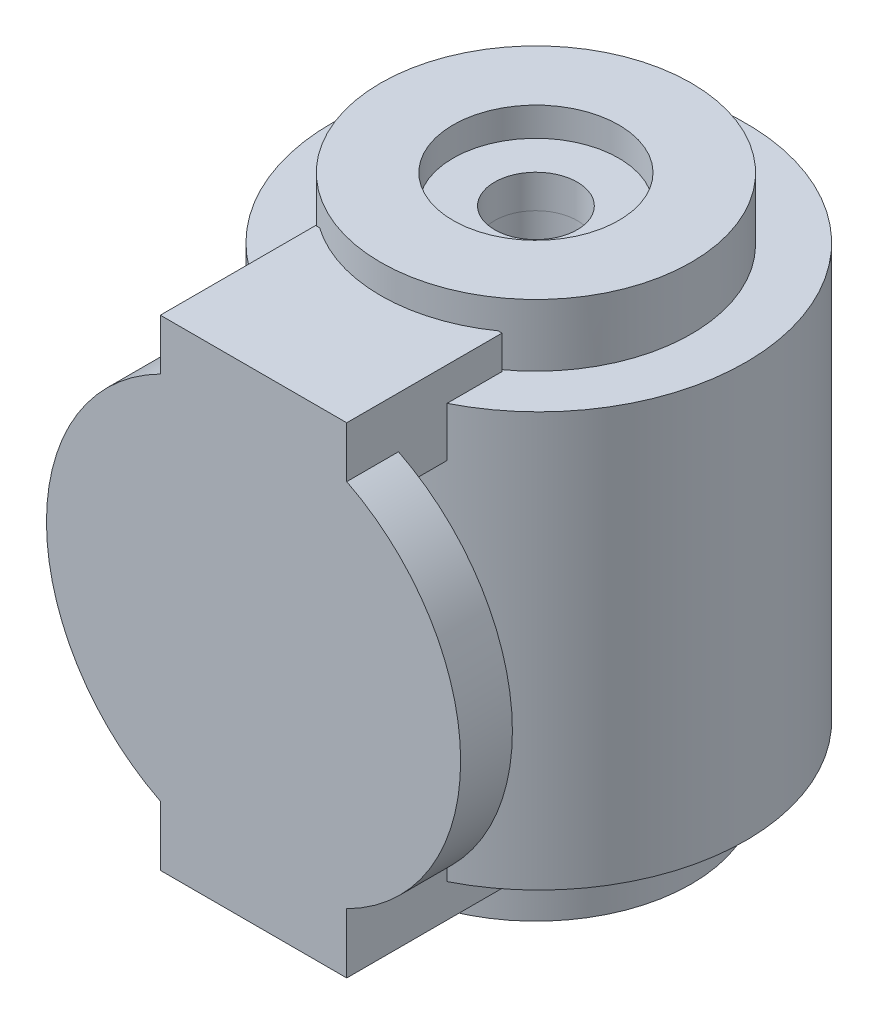
ISO-10303-21;
HEADER;
FILE_DESCRIPTION(('STEP AP214'),'2;1');
FILE_NAME('part.step','',(''),(''),'','','');
FILE_SCHEMA(('AUTOMOTIVE_DESIGN { 1 0 10303 214 1 1 1 1 }'));
ENDSEC;
DATA;
#1=APPLICATION_CONTEXT('core data for automotive mechanical design processes');
#2=APPLICATION_PROTOCOL_DEFINITION('international standard','automotive_design',2000,#1);
#3=PRODUCT_CONTEXT('',#1,'mechanical');
#4=PRODUCT('Part','Part','',(#3));
#5=PRODUCT_RELATED_PRODUCT_CATEGORY('part','',(#4));
#6=PRODUCT_DEFINITION_FORMATION('','',#4);
#7=PRODUCT_DEFINITION_CONTEXT('part definition',#1,'design');
#8=PRODUCT_DEFINITION('design','',#6,#7);
#9=PRODUCT_DEFINITION_SHAPE('','',#8);
#10=(LENGTH_UNIT() NAMED_UNIT(*) SI_UNIT(.MILLI.,.METRE.));
#11=(NAMED_UNIT(*) PLANE_ANGLE_UNIT() SI_UNIT($,.RADIAN.));
#12=(NAMED_UNIT(*) SI_UNIT($,.STERADIAN.) SOLID_ANGLE_UNIT());
#13=UNCERTAINTY_MEASURE_WITH_UNIT(LENGTH_MEASURE(1.E-05),#10,'distance_accuracy_value','');
#14=(GEOMETRIC_REPRESENTATION_CONTEXT(3) GLOBAL_UNCERTAINTY_ASSIGNED_CONTEXT((#13)) GLOBAL_UNIT_ASSIGNED_CONTEXT((#10,
#11,#12)) REPRESENTATION_CONTEXT('',''));
#15=CARTESIAN_POINT('',(0.,0.,0.));
#16=DIRECTION('',(0.,0.,1.));
#17=DIRECTION('',(1.,0.,0.));
#18=AXIS2_PLACEMENT_3D('',#15,#16,#17);
#19=CARTESIAN_POINT('',(0.,-27.2140253350102,-22.2721230621628));
#20=DIRECTION('',(0.,1.,0.));
#21=DIRECTION('',(0.,0.,1.));
#22=AXIS2_PLACEMENT_3D('',#19,#20,#21);
#23=CYLINDRICAL_SURFACE('',#22,4.);
#24=CARTESIAN_POINT('',(0.,-23.6524818491745,-22.2721230621628));
#25=DIRECTION('',(0.,-1.,0.));
#26=DIRECTION('',(0.,0.,-1.));
#27=AXIS2_PLACEMENT_3D('',#24,#25,#26);
#28=CIRCLE('',#27,4.);
#29=CARTESIAN_POINT('',(0.,-23.6524818491745,-26.2721230621628));
#30=VERTEX_POINT('',#29);
#31=EDGE_CURVE('E212',#30,#30,#28,.T.);
#32=ORIENTED_EDGE('',*,*,#31,.T.);
#33=EDGE_LOOP('',(#32));
#34=FACE_BOUND('',#33,.T.);
#35=CARTESIAN_POINT('',(0.,19.5659746649898,-22.2721230621628));
#36=DIRECTION('',(0.,1.,0.));
#37=DIRECTION('',(0.,0.,1.));
#38=AXIS2_PLACEMENT_3D('',#35,#36,#37);
#39=CIRCLE('',#38,4.);
#40=CARTESIAN_POINT('',(0.,19.5659746649898,-18.2721230621628));
#41=VERTEX_POINT('',#40);
#42=EDGE_CURVE('E11',#41,#41,#39,.F.);
#43=ORIENTED_EDGE('',*,*,#42,.F.);
#44=EDGE_LOOP('',(#43));
#45=FACE_BOUND('',#44,.T.);
#46=ADVANCED_FACE('F38',(#34,#45),#23,.F.);
#47=CARTESIAN_POINT('',(0.,0.,-10.));
#48=DIRECTION('',(0.,0.,1.));
#49=DIRECTION('',(1.,0.,0.));
#50=AXIS2_PLACEMENT_3D('',#47,#48,#49);
#51=PLANE('',#50);
#52=DIRECTION('',(0.,1.,0.));
#53=VECTOR('',#52,1.);
#54=CARTESIAN_POINT('',(8.6252533613299,-26.4340253350102,-10.));
#55=LINE('',#54,#53);
#56=CARTESIAN_POINT('',(8.6252533613299,-20.4340253350102,-10.));
#57=VERTEX_POINT('',#56);
#58=CARTESIAN_POINT('',(8.6252533613299,-23.6524818491745,-10.));
#59=VERTEX_POINT('',#58);
#60=EDGE_CURVE('E174',#57,#59,#55,.F.);
#61=ORIENTED_EDGE('',*,*,#60,.F.);
#62=DIRECTION('',(1.,0.,0.));
#63=VECTOR('',#62,1.);
#64=CARTESIAN_POINT('',(0.,-20.4340253350102,-10.));
#65=LINE('',#64,#63);
#66=CARTESIAN_POINT('',(9.,-20.4340253350102,-10.));
#67=VERTEX_POINT('',#66);
#68=EDGE_CURVE('E185',#57,#67,#65,.T.);
#69=ORIENTED_EDGE('',*,*,#68,.T.);
#70=DIRECTION('',(0.,1.,0.));
#71=VECTOR('',#70,1.);
#72=CARTESIAN_POINT('',(9.,-15.6524818491745,-10.));
#73=LINE('',#72,#71);
#74=CARTESIAN_POINT('',(9.,-23.6524818491745,-10.));
#75=VERTEX_POINT('',#74);
#76=EDGE_CURVE('E303',#75,#67,#73,.T.);
#77=ORIENTED_EDGE('',*,*,#76,.F.);
#78=DIRECTION('',(1.,0.,0.));
#79=VECTOR('',#78,1.);
#80=CARTESIAN_POINT('',(-9.,-23.6524818491745,-10.));
#81=LINE('',#80,#79);
#82=EDGE_CURVE('E187',#59,#75,#81,.T.);
#83=ORIENTED_EDGE('',*,*,#82,.F.);
#84=EDGE_LOOP('',(#61,#69,#77,#83));
#85=FACE_BOUND('',#84,.T.);
#86=ADVANCED_FACE('F183',(#85),#51,.F.);
#87=DIRECTION('',(0.,1.,0.));
#88=VECTOR('',#87,1.);
#89=CARTESIAN_POINT('',(-8.62525336133006,-26.4340253350102,-10.));
#90=LINE('',#89,#88);
#91=CARTESIAN_POINT('',(-8.62525336133006,-23.6524818491745,-10.));
#92=VERTEX_POINT('',#91);
#93=CARTESIAN_POINT('',(-8.62525336133006,-20.4340253350102,-10.));
#94=VERTEX_POINT('',#93);
#95=EDGE_CURVE('E53',#92,#94,#90,.T.);
#96=ORIENTED_EDGE('',*,*,#95,.F.);
#97=CARTESIAN_POINT('',(-9.,-23.6524818491745,-10.));
#98=VERTEX_POINT('',#97);
#99=EDGE_CURVE('E300',#98,#92,#81,.T.);
#100=ORIENTED_EDGE('',*,*,#99,.F.);
#101=DIRECTION('',(0.,-1.,0.));
#102=VECTOR('',#101,1.);
#103=CARTESIAN_POINT('',(-9.,-15.6524818491745,-10.));
#104=LINE('',#103,#102);
#105=CARTESIAN_POINT('',(-9.,-20.4340253350102,-10.));
#106=VERTEX_POINT('',#105);
#107=EDGE_CURVE('E297',#106,#98,#104,.T.);
#108=ORIENTED_EDGE('',*,*,#107,.F.);
#109=EDGE_CURVE('E196',#106,#94,#65,.T.);
#110=ORIENTED_EDGE('',*,*,#109,.T.);
#111=EDGE_LOOP('',(#96,#100,#108,#110));
#112=FACE_BOUND('',#111,.T.);
#113=ADVANCED_FACE('F429',(#112),#51,.F.);
#114=CARTESIAN_POINT('',(0.,0.,-10.));
#115=DIRECTION('',(0.,0.,-1.));
#116=DIRECTION('',(-1.,0.,0.));
#117=AXIS2_PLACEMENT_3D('',#114,#115,#116);
#118=PLANE('',#117);
#119=DIRECTION('',(0.,1.,0.));
#120=VECTOR('',#119,1.);
#121=CARTESIAN_POINT('',(-8.62525336132984,-16.8724818450102,-10.));
#122=LINE('',#121,#120);
#123=CARTESIAN_POINT('',(-8.62525336132984,19.5659746649898,-10.));
#124=VERTEX_POINT('',#123);
#125=CARTESIAN_POINT('',(-8.62525336132984,22.7859746649898,-10.));
#126=VERTEX_POINT('',#125);
#127=EDGE_CURVE('E236',#124,#126,#122,.T.);
#128=ORIENTED_EDGE('',*,*,#127,.F.);
#129=DIRECTION('',(-1.,0.,0.));
#130=VECTOR('',#129,1.);
#131=CARTESIAN_POINT('',(0.,19.5659746649898,-10.));
#132=LINE('',#131,#130);
#133=CARTESIAN_POINT('',(-9.,19.5659746649898,-10.));
#134=VERTEX_POINT('',#133);
#135=EDGE_CURVE('E351',#124,#134,#132,.T.);
#136=ORIENTED_EDGE('',*,*,#135,.T.);
#137=DIRECTION('',(0.,-1.,0.));
#138=VECTOR('',#137,1.);
#139=CARTESIAN_POINT('',(-9.,14.7859746649898,-10.));
#140=LINE('',#139,#138);
#141=CARTESIAN_POINT('',(-9.,22.7859746649898,-10.));
#142=VERTEX_POINT('',#141);
#143=EDGE_CURVE('E278',#142,#134,#140,.T.);
#144=ORIENTED_EDGE('',*,*,#143,.F.);
#145=DIRECTION('',(-1.,0.,0.));
#146=VECTOR('',#145,1.);
#147=CARTESIAN_POINT('',(-9.,22.7859746649898,-10.));
#148=LINE('',#147,#146);
#149=EDGE_CURVE('E267',#126,#142,#148,.T.);
#150=ORIENTED_EDGE('',*,*,#149,.F.);
#151=EDGE_LOOP('',(#128,#136,#144,#150));
#152=FACE_BOUND('',#151,.T.);
#153=ADVANCED_FACE('F360',(#152),#118,.T.);
#154=DIRECTION('',(0.,1.,0.));
#155=VECTOR('',#154,1.);
#156=CARTESIAN_POINT('',(8.62525336132984,-16.8724818450102,-10.));
#157=LINE('',#156,#155);
#158=CARTESIAN_POINT('',(8.62525336132984,22.7859746649898,-10.));
#159=VERTEX_POINT('',#158);
#160=CARTESIAN_POINT('',(8.62525336132984,19.5659746649898,-10.));
#161=VERTEX_POINT('',#160);
#162=EDGE_CURVE('E61',#159,#161,#157,.F.);
#163=ORIENTED_EDGE('',*,*,#162,.F.);
#164=CARTESIAN_POINT('',(9.,22.7859746649898,-10.));
#165=VERTEX_POINT('',#164);
#166=EDGE_CURVE('E284',#165,#159,#148,.T.);
#167=ORIENTED_EDGE('',*,*,#166,.F.);
#168=DIRECTION('',(0.,1.,0.));
#169=VECTOR('',#168,1.);
#170=CARTESIAN_POINT('',(9.,14.7859746649898,-10.));
#171=LINE('',#170,#169);
#172=CARTESIAN_POINT('',(9.,19.5659746649898,-10.));
#173=VERTEX_POINT('',#172);
#174=EDGE_CURVE('E287',#173,#165,#171,.T.);
#175=ORIENTED_EDGE('',*,*,#174,.F.);
#176=EDGE_CURVE('E199',#173,#161,#132,.T.);
#177=ORIENTED_EDGE('',*,*,#176,.T.);
#178=EDGE_LOOP('',(#163,#167,#175,#177));
#179=FACE_BOUND('',#178,.T.);
#180=ADVANCED_FACE('F378',(#179),#118,.T.);
#181=CARTESIAN_POINT('',(0.,0.,5.));
#182=DIRECTION('',(0.,0.,-1.));
#183=DIRECTION('',(-1.,0.,0.));
#184=AXIS2_PLACEMENT_3D('',#181,#182,#183);
#185=CYLINDRICAL_SURFACE('',#184,20.);
#186=CARTESIAN_POINT('',(0.,0.,5.));
#187=DIRECTION('',(0.,0.,1.));
#188=DIRECTION('',(1.,0.,0.));
#189=AXIS2_PLACEMENT_3D('',#186,#187,#188);
#190=CIRCLE('',#189,20.);
#191=CARTESIAN_POINT('',(-9.,17.8605710994918,5.));
#192=VERTEX_POINT('',#191);
#193=CARTESIAN_POINT('',(-9.,-17.8605710994918,5.));
#194=VERTEX_POINT('',#193);
#195=EDGE_CURVE('E331',#192,#194,#190,.T.);
#196=ORIENTED_EDGE('',*,*,#195,.F.);
#197=DIRECTION('',(0.,0.,-1.));
#198=VECTOR('',#197,1.);
#199=CARTESIAN_POINT('',(-9.,17.8605710994918,5.));
#200=LINE('',#199,#198);
#201=CARTESIAN_POINT('',(-9.,17.8605710994918,0.));
#202=VERTEX_POINT('',#201);
#203=EDGE_CURVE('E293',#192,#202,#200,.T.);
#204=ORIENTED_EDGE('',*,*,#203,.T.);
#205=CARTESIAN_POINT('',(0.,0.,0.));
#206=DIRECTION('',(0.,0.,1.));
#207=DIRECTION('',(1.,0.,0.));
#208=AXIS2_PLACEMENT_3D('',#205,#206,#207);
#209=CIRCLE('',#208,20.);
#210=CARTESIAN_POINT('',(-9.,-17.8605710994918,0.));
#211=VERTEX_POINT('',#210);
#212=EDGE_CURVE('E326',#202,#211,#209,.T.);
#213=ORIENTED_EDGE('',*,*,#212,.T.);
#214=DIRECTION('',(0.,0.,-1.));
#215=VECTOR('',#214,1.);
#216=CARTESIAN_POINT('',(-9.,-17.8605710994918,5.));
#217=LINE('',#216,#215);
#218=EDGE_CURVE('E323',#211,#194,#217,.F.);
#219=ORIENTED_EDGE('',*,*,#218,.T.);
#220=EDGE_LOOP('',(#196,#204,#213,#219));
#221=FACE_BOUND('',#220,.T.);
#222=ADVANCED_FACE('F397',(#221),#185,.T.);
#223=CARTESIAN_POINT('',(9.,-17.8605710994918,0.));
#224=VERTEX_POINT('',#223);
#225=CARTESIAN_POINT('',(9.,17.8605710994918,0.));
#226=VERTEX_POINT('',#225);
#227=EDGE_CURVE('E332',#224,#226,#209,.T.);
#228=ORIENTED_EDGE('',*,*,#227,.T.);
#229=DIRECTION('',(0.,0.,-1.));
#230=VECTOR('',#229,1.);
#231=CARTESIAN_POINT('',(9.,17.8605710994918,5.));
#232=LINE('',#231,#230);
#233=CARTESIAN_POINT('',(9.,17.8605710994918,5.));
#234=VERTEX_POINT('',#233);
#235=EDGE_CURVE('E283',#226,#234,#232,.F.);
#236=ORIENTED_EDGE('',*,*,#235,.T.);
#237=CARTESIAN_POINT('',(9.,-17.8605710994918,5.));
#238=VERTEX_POINT('',#237);
#239=EDGE_CURVE('E327',#238,#234,#190,.T.);
#240=ORIENTED_EDGE('',*,*,#239,.F.);
#241=DIRECTION('',(0.,0.,-1.));
#242=VECTOR('',#241,1.);
#243=CARTESIAN_POINT('',(9.,-17.8605710994918,5.));
#244=LINE('',#243,#242);
#245=EDGE_CURVE('E314',#238,#224,#244,.T.);
#246=ORIENTED_EDGE('',*,*,#245,.T.);
#247=EDGE_LOOP('',(#228,#236,#240,#246));
#248=FACE_BOUND('',#247,.T.);
#249=ADVANCED_FACE('F40',(#248),#185,.T.);
#250=CARTESIAN_POINT('',(0.,0.,5.));
#251=DIRECTION('',(0.,0.,1.));
#252=DIRECTION('',(1.,0.,0.));
#253=AXIS2_PLACEMENT_3D('',#250,#251,#252);
#254=PLANE('',#253);
#255=ORIENTED_EDGE('',*,*,#239,.T.);
#256=DIRECTION('',(0.,1.,0.));
#257=VECTOR('',#256,1.);
#258=CARTESIAN_POINT('',(9.,14.7859746649898,5.));
#259=LINE('',#258,#257);
#260=CARTESIAN_POINT('',(9.,22.7859746649898,5.));
#261=VERTEX_POINT('',#260);
#262=EDGE_CURVE('E277',#234,#261,#259,.T.);
#263=ORIENTED_EDGE('',*,*,#262,.T.);
#264=DIRECTION('',(-1.,0.,0.));
#265=VECTOR('',#264,1.);
#266=CARTESIAN_POINT('',(-9.,22.7859746649898,5.));
#267=LINE('',#266,#265);
#268=CARTESIAN_POINT('',(-9.,22.7859746649898,5.));
#269=VERTEX_POINT('',#268);
#270=EDGE_CURVE('E274',#261,#269,#267,.T.);
#271=ORIENTED_EDGE('',*,*,#270,.T.);
#272=DIRECTION('',(0.,-1.,0.));
#273=VECTOR('',#272,1.);
#274=CARTESIAN_POINT('',(-9.,14.7859746649898,5.));
#275=LINE('',#274,#273);
#276=EDGE_CURVE('E280',#269,#192,#275,.T.);
#277=ORIENTED_EDGE('',*,*,#276,.T.);
#278=ORIENTED_EDGE('',*,*,#195,.T.);
#279=DIRECTION('',(0.,-1.,0.));
#280=VECTOR('',#279,1.);
#281=CARTESIAN_POINT('',(-9.,-15.6524818491745,5.));
#282=LINE('',#281,#280);
#283=CARTESIAN_POINT('',(-9.,-23.6524818491745,5.));
#284=VERTEX_POINT('',#283);
#285=EDGE_CURVE('E296',#194,#284,#282,.T.);
#286=ORIENTED_EDGE('',*,*,#285,.T.);
#287=DIRECTION('',(1.,0.,0.));
#288=VECTOR('',#287,1.);
#289=CARTESIAN_POINT('',(-9.,-23.6524818491745,5.));
#290=LINE('',#289,#288);
#291=CARTESIAN_POINT('',(9.,-23.6524818491745,5.));
#292=VERTEX_POINT('',#291);
#293=EDGE_CURVE('E307',#284,#292,#290,.T.);
#294=ORIENTED_EDGE('',*,*,#293,.T.);
#295=DIRECTION('',(0.,1.,0.));
#296=VECTOR('',#295,1.);
#297=CARTESIAN_POINT('',(9.,-15.6524818491745,5.));
#298=LINE('',#297,#296);
#299=EDGE_CURVE('E299',#292,#238,#298,.T.);
#300=ORIENTED_EDGE('',*,*,#299,.T.);
#301=EDGE_LOOP('',(#255,#263,#271,#277,#278,#286,#294,#300));
#302=FACE_BOUND('',#301,.T.);
#303=ADVANCED_FACE('F401',(#302),#254,.T.);
#304=CARTESIAN_POINT('',(0.,0.,0.));
#305=DIRECTION('',(0.,0.,1.));
#306=DIRECTION('',(1.,0.,0.));
#307=AXIS2_PLACEMENT_3D('',#304,#305,#306);
#308=PLANE('',#307);
#309=ORIENTED_EDGE('',*,*,#212,.F.);
#310=DIRECTION('',(0.,-1.,0.));
#311=VECTOR('',#310,1.);
#312=CARTESIAN_POINT('',(-9.,0.,0.));
#313=LINE('',#312,#311);
#314=CARTESIAN_POINT('',(-9.,14.7859746649898,0.));
#315=VERTEX_POINT('',#314);
#316=EDGE_CURVE('E349',#202,#315,#313,.T.);
#317=ORIENTED_EDGE('',*,*,#316,.T.);
#318=DIRECTION('',(1.,0.,0.));
#319=VECTOR('',#318,1.);
#320=CARTESIAN_POINT('',(0.,14.7859746649898,0.));
#321=LINE('',#320,#319);
#322=CARTESIAN_POINT('',(9.,14.7859746649898,0.));
#323=VERTEX_POINT('',#322);
#324=EDGE_CURVE('E343',#315,#323,#321,.T.);
#325=ORIENTED_EDGE('',*,*,#324,.T.);
#326=DIRECTION('',(0.,1.,0.));
#327=VECTOR('',#326,1.);
#328=CARTESIAN_POINT('',(9.,0.,0.));
#329=LINE('',#328,#327);
#330=EDGE_CURVE('E346',#323,#226,#329,.T.);
#331=ORIENTED_EDGE('',*,*,#330,.T.);
#332=ORIENTED_EDGE('',*,*,#227,.F.);
#333=DIRECTION('',(0.,1.,0.));
#334=VECTOR('',#333,1.);
#335=CARTESIAN_POINT('',(9.,0.,0.));
#336=LINE('',#335,#334);
#337=CARTESIAN_POINT('',(9.,-15.6524818491745,0.));
#338=VERTEX_POINT('',#337);
#339=EDGE_CURVE('E330',#224,#338,#336,.T.);
#340=ORIENTED_EDGE('',*,*,#339,.T.);
#341=DIRECTION('',(-1.,0.,0.));
#342=VECTOR('',#341,1.);
#343=CARTESIAN_POINT('',(0.,-15.6524818491745,0.));
#344=LINE('',#343,#342);
#345=CARTESIAN_POINT('',(-9.,-15.6524818491745,0.));
#346=VERTEX_POINT('',#345);
#347=EDGE_CURVE('E337',#338,#346,#344,.T.);
#348=ORIENTED_EDGE('',*,*,#347,.T.);
#349=DIRECTION('',(0.,-1.,0.));
#350=VECTOR('',#349,1.);
#351=CARTESIAN_POINT('',(-9.,0.,0.));
#352=LINE('',#351,#350);
#353=EDGE_CURVE('E340',#346,#211,#352,.T.);
#354=ORIENTED_EDGE('',*,*,#353,.T.);
#355=EDGE_LOOP('',(#309,#317,#325,#331,#332,#340,#348,#354));
#356=FACE_BOUND('',#355,.T.);
#357=ADVANCED_FACE('F394',(#356),#308,.F.);
#358=CARTESIAN_POINT('',(-9.,-15.6524818491745,-10.));
#359=DIRECTION('',(-1.,0.,0.));
#360=DIRECTION('',(0.,-1.,0.));
#361=AXIS2_PLACEMENT_3D('',#358,#359,#360);
#362=PLANE('',#361);
#363=DIRECTION('',(0.,-1.,0.));
#364=VECTOR('',#363,1.);
#365=CARTESIAN_POINT('',(-9.00000000000001,19.5659746649898,-4.68667550556135));
#366=LINE('',#365,#364);
#367=CARTESIAN_POINT('',(-9.,-20.4340253350102,-4.68667550556134));
#368=VERTEX_POINT('',#367);
#369=CARTESIAN_POINT('',(-9.,-15.6524818491745,-4.68667550556134));
#370=VERTEX_POINT('',#369);
#371=EDGE_CURVE('E259',#368,#370,#366,.F.);
#372=ORIENTED_EDGE('',*,*,#371,.F.);
#373=DIRECTION('',(0.,0.,1.));
#374=VECTOR('',#373,1.);
#375=CARTESIAN_POINT('',(-9.,-20.4340253350102,-10.));
#376=LINE('',#375,#374);
#377=EDGE_CURVE('E262',#106,#368,#376,.T.);
#378=ORIENTED_EDGE('',*,*,#377,.F.);
#379=ORIENTED_EDGE('',*,*,#107,.T.);
#380=DIRECTION('',(0.,0.,1.));
#381=VECTOR('',#380,1.);
#382=CARTESIAN_POINT('',(-9.,-23.6524818491745,-10.));
#383=LINE('',#382,#381);
#384=EDGE_CURVE('E305',#98,#284,#383,.T.);
#385=ORIENTED_EDGE('',*,*,#384,.T.);
#386=ORIENTED_EDGE('',*,*,#285,.F.);
#387=ORIENTED_EDGE('',*,*,#218,.F.);
#388=ORIENTED_EDGE('',*,*,#353,.F.);
#389=DIRECTION('',(0.,0.,1.));
#390=VECTOR('',#389,1.);
#391=CARTESIAN_POINT('',(-9.,-15.6524818491745,-10.));
#392=LINE('',#391,#390);
#393=EDGE_CURVE('E312',#370,#346,#392,.T.);
#394=ORIENTED_EDGE('',*,*,#393,.F.);
#395=EDGE_LOOP('',(#372,#378,#379,#385,#386,#387,#388,#394));
#396=FACE_BOUND('',#395,.T.);
#397=ADVANCED_FACE('F404',(#396),#362,.T.);
#398=CARTESIAN_POINT('',(-9.,-15.6524818491745,-10.));
#399=DIRECTION('',(0.,1.,0.));
#400=DIRECTION('',(-1.,0.,0.));
#401=AXIS2_PLACEMENT_3D('',#398,#399,#400);
#402=PLANE('',#401);
#403=CARTESIAN_POINT('',(0.,-15.6524818491745,-22.5472466050531));
#404=DIRECTION('',(0.,1.,0.));
#405=DIRECTION('',(-1.,0.,0.));
#406=AXIS2_PLACEMENT_3D('',#403,#404,#405);
#407=CIRCLE('',#406,20.);
#408=CARTESIAN_POINT('',(8.99999999999999,-15.6524818491745,-4.68667550556134));
#409=VERTEX_POINT('',#408);
#410=EDGE_CURVE('E257',#370,#409,#407,.T.);
#411=ORIENTED_EDGE('',*,*,#410,.F.);
#412=ORIENTED_EDGE('',*,*,#393,.T.);
#413=ORIENTED_EDGE('',*,*,#347,.F.);
#414=DIRECTION('',(0.,0.,1.));
#415=VECTOR('',#414,1.);
#416=CARTESIAN_POINT('',(9.,-15.6524818491745,-10.));
#417=LINE('',#416,#415);
#418=EDGE_CURVE('E315',#409,#338,#417,.T.);
#419=ORIENTED_EDGE('',*,*,#418,.F.);
#420=EDGE_LOOP('',(#411,#412,#413,#419));
#421=FACE_BOUND('',#420,.T.);
#422=ADVANCED_FACE('F425',(#421),#402,.T.);
#423=CARTESIAN_POINT('',(9.,-15.6524818491745,-10.));
#424=DIRECTION('',(1.,0.,0.));
#425=DIRECTION('',(0.,1.,0.));
#426=AXIS2_PLACEMENT_3D('',#423,#424,#425);
#427=PLANE('',#426);
#428=DIRECTION('',(0.,-1.,0.));
#429=VECTOR('',#428,1.);
#430=CARTESIAN_POINT('',(8.99999999999999,19.5659746649898,-4.68667550556134));
#431=LINE('',#430,#429);
#432=CARTESIAN_POINT('',(9.,-20.4340253350102,-4.68667550556134));
#433=VERTEX_POINT('',#432);
#434=EDGE_CURVE('E255',#409,#433,#431,.T.);
#435=ORIENTED_EDGE('',*,*,#434,.F.);
#436=ORIENTED_EDGE('',*,*,#418,.T.);
#437=ORIENTED_EDGE('',*,*,#339,.F.);
#438=ORIENTED_EDGE('',*,*,#245,.F.);
#439=ORIENTED_EDGE('',*,*,#299,.F.);
#440=DIRECTION('',(0.,0.,1.));
#441=VECTOR('',#440,1.);
#442=CARTESIAN_POINT('',(9.,-23.6524818491745,-10.));
#443=LINE('',#442,#441);
#444=EDGE_CURVE('E317',#75,#292,#443,.T.);
#445=ORIENTED_EDGE('',*,*,#444,.F.);
#446=ORIENTED_EDGE('',*,*,#76,.T.);
#447=DIRECTION('',(0.,0.,-1.));
#448=VECTOR('',#447,1.);
#449=CARTESIAN_POINT('',(9.,-20.4340253350102,-10.));
#450=LINE('',#449,#448);
#451=EDGE_CURVE('E194',#433,#67,#450,.T.);
#452=ORIENTED_EDGE('',*,*,#451,.F.);
#453=EDGE_LOOP('',(#435,#436,#437,#438,#439,#445,#446,#452));
#454=FACE_BOUND('',#453,.T.);
#455=ADVANCED_FACE('F421',(#454),#427,.T.);
#456=CARTESIAN_POINT('',(-9.,-23.6524818491745,-10.));
#457=DIRECTION('',(0.,-1.,0.));
#458=DIRECTION('',(0.,0.,-1.));
#459=AXIS2_PLACEMENT_3D('',#456,#457,#458);
#460=PLANE('',#459);
#461=ORIENTED_EDGE('',*,*,#99,.T.);
#462=CARTESIAN_POINT('',(0.,-23.6524818491745,-22.2721230621628));
#463=DIRECTION('',(0.,-1.,0.));
#464=DIRECTION('',(0.,0.,-1.));
#465=AXIS2_PLACEMENT_3D('',#462,#463,#464);
#466=CIRCLE('',#465,15.0000000000001);
#467=EDGE_CURVE('E189',#92,#59,#466,.F.);
#468=ORIENTED_EDGE('',*,*,#467,.T.);
#469=ORIENTED_EDGE('',*,*,#82,.T.);
#470=ORIENTED_EDGE('',*,*,#444,.T.);
#471=ORIENTED_EDGE('',*,*,#293,.F.);
#472=ORIENTED_EDGE('',*,*,#384,.F.);
#473=EDGE_LOOP('',(#461,#468,#469,#470,#471,#472));
#474=FACE_BOUND('',#473,.T.);
#475=ADVANCED_FACE('F412',(#474),#460,.T.);
#476=CARTESIAN_POINT('',(-9.,14.7859746649898,-10.));
#477=DIRECTION('',(-1.,0.,0.));
#478=DIRECTION('',(0.,0.,1.));
#479=AXIS2_PLACEMENT_3D('',#476,#477,#478);
#480=PLANE('',#479);
#481=DIRECTION('',(0.,-1.,0.));
#482=VECTOR('',#481,1.);
#483=CARTESIAN_POINT('',(-9.,19.5659746649898,-4.68667550556134));
#484=LINE('',#483,#482);
#485=CARTESIAN_POINT('',(-9.,14.7859746649898,-4.68667550556134));
#486=VERTEX_POINT('',#485);
#487=CARTESIAN_POINT('',(-9.,19.5659746649898,-4.68667550556134));
#488=VERTEX_POINT('',#487);
#489=EDGE_CURVE('E253',#486,#488,#484,.F.);
#490=ORIENTED_EDGE('',*,*,#489,.F.);
#491=DIRECTION('',(0.,0.,1.));
#492=VECTOR('',#491,1.);
#493=CARTESIAN_POINT('',(-9.,14.7859746649898,-10.));
#494=LINE('',#493,#492);
#495=EDGE_CURVE('E265',#486,#315,#494,.T.);
#496=ORIENTED_EDGE('',*,*,#495,.T.);
#497=ORIENTED_EDGE('',*,*,#316,.F.);
#498=ORIENTED_EDGE('',*,*,#203,.F.);
#499=ORIENTED_EDGE('',*,*,#276,.F.);
#500=DIRECTION('',(0.,0.,1.));
#501=VECTOR('',#500,1.);
#502=CARTESIAN_POINT('',(-9.,22.7859746649898,-10.));
#503=LINE('',#502,#501);
#504=EDGE_CURVE('E264',#142,#269,#503,.T.);
#505=ORIENTED_EDGE('',*,*,#504,.F.);
#506=ORIENTED_EDGE('',*,*,#143,.T.);
#507=DIRECTION('',(0.,0.,1.));
#508=VECTOR('',#507,1.);
#509=CARTESIAN_POINT('',(-9.,19.5659746649898,-10.));
#510=LINE('',#509,#508);
#511=EDGE_CURVE('E248',#134,#488,#510,.T.);
#512=ORIENTED_EDGE('',*,*,#511,.T.);
#513=EDGE_LOOP('',(#490,#496,#497,#498,#499,#505,#506,#512));
#514=FACE_BOUND('',#513,.T.);
#515=ADVANCED_FACE('F368',(#514),#480,.T.);
#516=CARTESIAN_POINT('',(9.,14.7859746649898,-10.));
#517=DIRECTION('',(1.,0.,0.));
#518=DIRECTION('',(0.,0.,-1.));
#519=AXIS2_PLACEMENT_3D('',#516,#517,#518);
#520=PLANE('',#519);
#521=DIRECTION('',(0.,-1.,0.));
#522=VECTOR('',#521,1.);
#523=CARTESIAN_POINT('',(9.,19.5659746649898,-4.68667550556134));
#524=LINE('',#523,#522);
#525=CARTESIAN_POINT('',(9.,19.5659746649898,-4.68667550556134));
#526=VERTEX_POINT('',#525);
#527=CARTESIAN_POINT('',(9.,14.7859746649898,-4.68667550556134));
#528=VERTEX_POINT('',#527);
#529=EDGE_CURVE('E251',#526,#528,#524,.T.);
#530=ORIENTED_EDGE('',*,*,#529,.F.);
#531=DIRECTION('',(0.,0.,-1.));
#532=VECTOR('',#531,1.);
#533=CARTESIAN_POINT('',(9.,19.5659746649898,-10.));
#534=LINE('',#533,#532);
#535=EDGE_CURVE('E245',#526,#173,#534,.T.);
#536=ORIENTED_EDGE('',*,*,#535,.T.);
#537=ORIENTED_EDGE('',*,*,#174,.T.);
#538=DIRECTION('',(0.,0.,1.));
#539=VECTOR('',#538,1.);
#540=CARTESIAN_POINT('',(9.,22.7859746649898,-10.));
#541=LINE('',#540,#539);
#542=EDGE_CURVE('E270',#165,#261,#541,.T.);
#543=ORIENTED_EDGE('',*,*,#542,.T.);
#544=ORIENTED_EDGE('',*,*,#262,.F.);
#545=ORIENTED_EDGE('',*,*,#235,.F.);
#546=ORIENTED_EDGE('',*,*,#330,.F.);
#547=DIRECTION('',(0.,0.,1.));
#548=VECTOR('',#547,1.);
#549=CARTESIAN_POINT('',(9.,14.7859746649898,-10.));
#550=LINE('',#549,#548);
#551=EDGE_CURVE('E268',#528,#323,#550,.T.);
#552=ORIENTED_EDGE('',*,*,#551,.F.);
#553=EDGE_LOOP('',(#530,#536,#537,#543,#544,#545,#546,#552));
#554=FACE_BOUND('',#553,.T.);
#555=ADVANCED_FACE('F381',(#554),#520,.T.);
#556=CARTESIAN_POINT('',(-9.,14.7859746649898,-10.));
#557=DIRECTION('',(0.,-1.,0.));
#558=DIRECTION('',(1.,0.,0.));
#559=AXIS2_PLACEMENT_3D('',#556,#557,#558);
#560=PLANE('',#559);
#561=CARTESIAN_POINT('',(0.,14.7859746649898,-22.5472466050531));
#562=DIRECTION('',(0.,-1.,0.));
#563=DIRECTION('',(1.,0.,0.));
#564=AXIS2_PLACEMENT_3D('',#561,#562,#563);
#565=CIRCLE('',#564,20.);
#566=EDGE_CURVE('E197',#528,#486,#565,.T.);
#567=ORIENTED_EDGE('',*,*,#566,.F.);
#568=ORIENTED_EDGE('',*,*,#551,.T.);
#569=ORIENTED_EDGE('',*,*,#324,.F.);
#570=ORIENTED_EDGE('',*,*,#495,.F.);
#571=EDGE_LOOP('',(#567,#568,#569,#570));
#572=FACE_BOUND('',#571,.T.);
#573=ADVANCED_FACE('F390',(#572),#560,.T.);
#574=CARTESIAN_POINT('',(-9.,22.7859746649898,-10.));
#575=DIRECTION('',(0.,1.,0.));
#576=DIRECTION('',(0.,0.,1.));
#577=AXIS2_PLACEMENT_3D('',#574,#575,#576);
#578=PLANE('',#577);
#579=CARTESIAN_POINT('',(0.,22.7859746649898,-22.2721230621628));
#580=DIRECTION('',(0.,1.,0.));
#581=DIRECTION('',(0.,0.,1.));
#582=AXIS2_PLACEMENT_3D('',#579,#580,#581);
#583=CIRCLE('',#582,15.);
#584=EDGE_CURVE('E238',#126,#159,#583,.T.);
#585=ORIENTED_EDGE('',*,*,#584,.F.);
#586=ORIENTED_EDGE('',*,*,#149,.T.);
#587=ORIENTED_EDGE('',*,*,#504,.T.);
#588=ORIENTED_EDGE('',*,*,#270,.F.);
#589=ORIENTED_EDGE('',*,*,#542,.F.);
#590=ORIENTED_EDGE('',*,*,#166,.T.);
#591=EDGE_LOOP('',(#585,#586,#587,#588,#589,#590));
#592=FACE_BOUND('',#591,.T.);
#593=ADVANCED_FACE('F373',(#592),#578,.T.);
#594=CARTESIAN_POINT('',(0.,19.5659746649898,-22.5472466050531));
#595=DIRECTION('',(0.,-1.,0.));
#596=DIRECTION('',(1.,0.,0.));
#597=AXIS2_PLACEMENT_3D('',#594,#595,#596);
#598=CYLINDRICAL_SURFACE('',#597,20.);
#599=ORIENTED_EDGE('',*,*,#566,.T.);
#600=ORIENTED_EDGE('',*,*,#489,.T.);
#601=CARTESIAN_POINT('',(0.,19.5659746649898,-22.5472466050531));
#602=DIRECTION('',(0.,-1.,0.));
#603=DIRECTION('',(1.,0.,0.));
#604=AXIS2_PLACEMENT_3D('',#601,#602,#603);
#605=CIRCLE('',#604,20.);
#606=EDGE_CURVE('E242',#488,#526,#605,.T.);
#607=ORIENTED_EDGE('',*,*,#606,.T.);
#608=ORIENTED_EDGE('',*,*,#529,.T.);
#609=EDGE_LOOP('',(#599,#600,#607,#608));
#610=FACE_BOUND('',#609,.T.);
#611=CARTESIAN_POINT('',(0.,-20.4340253350102,-22.5472466050531));
#612=DIRECTION('',(0.,-1.,0.));
#613=DIRECTION('',(1.,0.,0.));
#614=AXIS2_PLACEMENT_3D('',#611,#612,#613);
#615=CIRCLE('',#614,20.);
#616=EDGE_CURVE('E240',#368,#433,#615,.T.);
#617=ORIENTED_EDGE('',*,*,#616,.F.);
#618=ORIENTED_EDGE('',*,*,#371,.T.);
#619=ORIENTED_EDGE('',*,*,#410,.T.);
#620=ORIENTED_EDGE('',*,*,#434,.T.);
#621=EDGE_LOOP('',(#617,#618,#619,#620));
#622=FACE_BOUND('',#621,.T.);
#623=ADVANCED_FACE('F384',(#610,#622),#598,.T.);
#624=CARTESIAN_POINT('',(0.,19.5659746649898,-22.5472466050531));
#625=DIRECTION('',(0.,-1.,0.));
#626=DIRECTION('',(1.,0.,0.));
#627=AXIS2_PLACEMENT_3D('',#624,#625,#626);
#628=PLANE('',#627);
#629=ORIENTED_EDGE('',*,*,#135,.F.);
#630=CARTESIAN_POINT('',(0.,19.5659746649898,-22.2721230621628));
#631=DIRECTION('',(0.,-1.,0.));
#632=DIRECTION('',(1.,0.,0.));
#633=AXIS2_PLACEMENT_3D('',#630,#631,#632);
#634=CIRCLE('',#633,15.);
#635=EDGE_CURVE('E179',#124,#161,#634,.T.);
#636=ORIENTED_EDGE('',*,*,#635,.T.);
#637=ORIENTED_EDGE('',*,*,#176,.F.);
#638=ORIENTED_EDGE('',*,*,#535,.F.);
#639=ORIENTED_EDGE('',*,*,#606,.F.);
#640=ORIENTED_EDGE('',*,*,#511,.F.);
#641=EDGE_LOOP('',(#629,#636,#637,#638,#639,#640));
#642=FACE_BOUND('',#641,.T.);
#643=ADVANCED_FACE('F364',(#642),#628,.F.);
#644=CARTESIAN_POINT('',(0.,-20.4340253350102,-22.5472466050531));
#645=DIRECTION('',(0.,-1.,0.));
#646=DIRECTION('',(1.,0.,0.));
#647=AXIS2_PLACEMENT_3D('',#644,#645,#646);
#648=PLANE('',#647);
#649=ORIENTED_EDGE('',*,*,#68,.F.);
#650=CARTESIAN_POINT('',(0.,-20.4340253350102,-22.2721230621628));
#651=DIRECTION('',(0.,-1.,0.));
#652=DIRECTION('',(1.,0.,0.));
#653=AXIS2_PLACEMENT_3D('',#650,#651,#652);
#654=CIRCLE('',#653,15.0000000000001);
#655=EDGE_CURVE('E46',#57,#94,#654,.F.);
#656=ORIENTED_EDGE('',*,*,#655,.T.);
#657=ORIENTED_EDGE('',*,*,#109,.F.);
#658=ORIENTED_EDGE('',*,*,#377,.T.);
#659=ORIENTED_EDGE('',*,*,#616,.T.);
#660=ORIENTED_EDGE('',*,*,#451,.T.);
#661=EDGE_LOOP('',(#649,#656,#657,#658,#659,#660));
#662=FACE_BOUND('',#661,.T.);
#663=ADVANCED_FACE('F191',(#662),#648,.T.);
#664=CARTESIAN_POINT('',(0.,-16.8724818450102,-22.2721230621628));
#665=DIRECTION('',(0.,1.,0.));
#666=DIRECTION('',(-1.,0.,0.));
#667=AXIS2_PLACEMENT_3D('',#664,#665,#666);
#668=CYLINDRICAL_SURFACE('',#667,15.);
#669=ORIENTED_EDGE('',*,*,#127,.T.);
#670=ORIENTED_EDGE('',*,*,#584,.T.);
#671=ORIENTED_EDGE('',*,*,#162,.T.);
#672=ORIENTED_EDGE('',*,*,#635,.F.);
#673=EDGE_LOOP('',(#669,#670,#671,#672));
#674=FACE_BOUND('',#673,.T.);
#675=CARTESIAN_POINT('',(0.,25.5659746649898,-22.2721230621628));
#676=DIRECTION('',(0.,1.,0.));
#677=DIRECTION('',(-1.,0.,0.));
#678=AXIS2_PLACEMENT_3D('',#675,#676,#677);
#679=CIRCLE('',#678,15.);
#680=CARTESIAN_POINT('',(-15.,25.5659746649898,-22.2721230621628));
#681=VERTEX_POINT('',#680);
#682=EDGE_CURVE('E206',#681,#681,#679,.T.);
#683=ORIENTED_EDGE('',*,*,#682,.F.);
#684=EDGE_LOOP('',(#683));
#685=FACE_BOUND('',#684,.T.);
#686=ADVANCED_FACE('F376',(#674,#685),#668,.T.);
#687=CARTESIAN_POINT('',(0.,25.5659746649898,-22.2721230621628));
#688=DIRECTION('',(0.,1.,0.));
#689=DIRECTION('',(-1.,0.,0.));
#690=AXIS2_PLACEMENT_3D('',#687,#688,#689);
#691=PLANE('',#690);
#692=CARTESIAN_POINT('',(0.,25.5659746649898,-22.2721230621628));
#693=DIRECTION('',(0.,1.,0.));
#694=DIRECTION('',(-1.,0.,0.));
#695=AXIS2_PLACEMENT_3D('',#692,#693,#694);
#696=CIRCLE('',#695,8.);
#697=CARTESIAN_POINT('',(-8.,25.5659746649898,-22.2721230621628));
#698=VERTEX_POINT('',#697);
#699=EDGE_CURVE('E204',#698,#698,#696,.F.);
#700=ORIENTED_EDGE('',*,*,#699,.T.);
#701=EDGE_LOOP('',(#700));
#702=FACE_BOUND('',#701,.T.);
#703=ORIENTED_EDGE('',*,*,#682,.T.);
#704=EDGE_LOOP('',(#703));
#705=FACE_BOUND('',#704,.T.);
#706=ADVANCED_FACE('F469',(#702,#705),#691,.T.);
#707=CARTESIAN_POINT('',(0.,28.7859746649898,-22.2721230621628));
#708=DIRECTION('',(0.,-1.,0.));
#709=DIRECTION('',(0.,0.,-1.));
#710=AXIS2_PLACEMENT_3D('',#707,#708,#709);
#711=CYLINDRICAL_SURFACE('',#710,8.);
#712=ORIENTED_EDGE('',*,*,#699,.F.);
#713=EDGE_LOOP('',(#712));
#714=FACE_BOUND('',#713,.T.);
#715=CARTESIAN_POINT('',(0.,22.7859746649898,-22.2721230621628));
#716=DIRECTION('',(0.,1.,0.));
#717=DIRECTION('',(0.,0.,1.));
#718=AXIS2_PLACEMENT_3D('',#715,#716,#717);
#719=CIRCLE('',#718,8.);
#720=CARTESIAN_POINT('',(0.,22.7859746649898,-14.2721230621628));
#721=VERTEX_POINT('',#720);
#722=EDGE_CURVE('E188',#721,#721,#719,.T.);
#723=ORIENTED_EDGE('',*,*,#722,.F.);
#724=EDGE_LOOP('',(#723));
#725=FACE_BOUND('',#724,.T.);
#726=ADVANCED_FACE('F465',(#714,#725),#711,.F.);
#727=CARTESIAN_POINT('',(0.,22.7859746649898,-22.2721230621628));
#728=DIRECTION('',(0.,1.,0.));
#729=DIRECTION('',(0.,0.,1.));
#730=AXIS2_PLACEMENT_3D('',#727,#728,#729);
#731=PLANE('',#730);
#732=ORIENTED_EDGE('',*,*,#722,.T.);
#733=EDGE_LOOP('',(#732));
#734=FACE_BOUND('',#733,.T.);
#735=CARTESIAN_POINT('',(0.,22.7859746649898,-22.2721230621628));
#736=DIRECTION('',(0.,1.,0.));
#737=DIRECTION('',(0.,0.,1.));
#738=AXIS2_PLACEMENT_3D('',#735,#736,#737);
#739=CIRCLE('',#738,3.99);
#740=CARTESIAN_POINT('',(0.,22.7859746649898,-18.2821230621628));
#741=VERTEX_POINT('',#740);
#742=EDGE_CURVE('E220',#741,#741,#739,.T.);
#743=ORIENTED_EDGE('',*,*,#742,.F.);
#744=EDGE_LOOP('',(#743));
#745=FACE_BOUND('',#744,.T.);
#746=ADVANCED_FACE('F461',(#734,#745),#731,.T.);
#747=CARTESIAN_POINT('',(0.,-26.4340253350102,-22.2721230621628));
#748=DIRECTION('',(0.,1.,0.));
#749=DIRECTION('',(-1.,0.,0.));
#750=AXIS2_PLACEMENT_3D('',#747,#748,#749);
#751=CYLINDRICAL_SURFACE('',#750,15.0000000000001);
#752=CARTESIAN_POINT('',(0.,-26.4340253350102,-22.2721230621628));
#753=DIRECTION('',(0.,-1.,0.));
#754=DIRECTION('',(1.,0.,0.));
#755=AXIS2_PLACEMENT_3D('',#752,#753,#754);
#756=CIRCLE('',#755,15.0000000000001);
#757=CARTESIAN_POINT('',(15.,-26.4340253350102,-22.2721230621628));
#758=VERTEX_POINT('',#757);
#759=EDGE_CURVE('E210',#758,#758,#756,.T.);
#760=ORIENTED_EDGE('',*,*,#759,.F.);
#761=EDGE_LOOP('',(#760));
#762=FACE_BOUND('',#761,.T.);
#763=ORIENTED_EDGE('',*,*,#655,.F.);
#764=ORIENTED_EDGE('',*,*,#60,.T.);
#765=ORIENTED_EDGE('',*,*,#467,.F.);
#766=ORIENTED_EDGE('',*,*,#95,.T.);
#767=EDGE_LOOP('',(#763,#764,#765,#766));
#768=FACE_BOUND('',#767,.T.);
#769=ADVANCED_FACE('F173',(#762,#768),#751,.T.);
#770=CARTESIAN_POINT('',(0.,-26.4340253350102,-22.2721230621628));
#771=DIRECTION('',(0.,-1.,0.));
#772=DIRECTION('',(1.,0.,0.));
#773=AXIS2_PLACEMENT_3D('',#770,#771,#772);
#774=PLANE('',#773);
#775=CARTESIAN_POINT('',(0.,-26.4340253350102,-22.2721230621628));
#776=DIRECTION('',(0.,-1.,0.));
#777=DIRECTION('',(1.,0.,0.));
#778=AXIS2_PLACEMENT_3D('',#775,#776,#777);
#779=CIRCLE('',#778,8.);
#780=CARTESIAN_POINT('',(8.,-26.4340253350102,-22.2721230621628));
#781=VERTEX_POINT('',#780);
#782=EDGE_CURVE('E208',#781,#781,#779,.F.);
#783=ORIENTED_EDGE('',*,*,#782,.T.);
#784=EDGE_LOOP('',(#783));
#785=FACE_BOUND('',#784,.T.);
#786=ORIENTED_EDGE('',*,*,#759,.T.);
#787=EDGE_LOOP('',(#786));
#788=FACE_BOUND('',#787,.T.);
#789=ADVANCED_FACE('F454',(#785,#788),#774,.T.);
#790=CARTESIAN_POINT('',(0.,-29.6524818491745,-22.2721230621628));
#791=DIRECTION('',(0.,1.,0.));
#792=DIRECTION('',(0.,0.,1.));
#793=AXIS2_PLACEMENT_3D('',#790,#791,#792);
#794=CYLINDRICAL_SURFACE('',#793,8.);
#795=ORIENTED_EDGE('',*,*,#782,.F.);
#796=EDGE_LOOP('',(#795));
#797=FACE_BOUND('',#796,.T.);
#798=CARTESIAN_POINT('',(0.,-23.6524818491745,-22.2721230621628));
#799=DIRECTION('',(0.,-1.,0.));
#800=DIRECTION('',(0.,0.,-1.));
#801=AXIS2_PLACEMENT_3D('',#798,#799,#800);
#802=CIRCLE('',#801,8.);
#803=CARTESIAN_POINT('',(0.,-23.6524818491745,-30.2721230621628));
#804=VERTEX_POINT('',#803);
#805=EDGE_CURVE('E211',#804,#804,#802,.T.);
#806=ORIENTED_EDGE('',*,*,#805,.F.);
#807=EDGE_LOOP('',(#806));
#808=FACE_BOUND('',#807,.T.);
#809=ADVANCED_FACE('F450',(#797,#808),#794,.F.);
#810=CARTESIAN_POINT('',(0.,-23.6524818491745,-22.2721230621628));
#811=DIRECTION('',(0.,-1.,0.));
#812=DIRECTION('',(0.,0.,-1.));
#813=AXIS2_PLACEMENT_3D('',#810,#811,#812);
#814=PLANE('',#813);
#815=ORIENTED_EDGE('',*,*,#31,.F.);
#816=EDGE_LOOP('',(#815));
#817=FACE_BOUND('',#816,.T.);
#818=ORIENTED_EDGE('',*,*,#805,.T.);
#819=EDGE_LOOP('',(#818));
#820=FACE_BOUND('',#819,.T.);
#821=ADVANCED_FACE('F447',(#817,#820),#814,.T.);
#822=CARTESIAN_POINT('',(0.,19.5659746649898,-22.2721230621628));
#823=DIRECTION('',(0.,1.,0.));
#824=DIRECTION('',(0.,0.,1.));
#825=AXIS2_PLACEMENT_3D('',#822,#823,#824);
#826=PLANE('',#825);
#827=CARTESIAN_POINT('',(0.,19.5659746649898,-22.2721230621628));
#828=DIRECTION('',(0.,1.,0.));
#829=DIRECTION('',(0.,0.,1.));
#830=AXIS2_PLACEMENT_3D('',#827,#828,#829);
#831=CIRCLE('',#830,3.99);
#832=CARTESIAN_POINT('',(0.,19.5659746649898,-18.2821230621628));
#833=VERTEX_POINT('',#832);
#834=EDGE_CURVE('E214',#833,#833,#831,.T.);
#835=ORIENTED_EDGE('',*,*,#834,.T.);
#836=EDGE_LOOP('',(#835));
#837=FACE_BOUND('',#836,.T.);
#838=ORIENTED_EDGE('',*,*,#42,.T.);
#839=EDGE_LOOP('',(#838));
#840=FACE_BOUND('',#839,.T.);
#841=ADVANCED_FACE('F445',(#837,#840),#826,.F.);
#842=CARTESIAN_POINT('',(0.,19.5659746649898,-22.2721230621628));
#843=DIRECTION('',(0.,1.,0.));
#844=DIRECTION('',(0.,0.,1.));
#845=AXIS2_PLACEMENT_3D('',#842,#843,#844);
#846=CYLINDRICAL_SURFACE('',#845,3.99);
#847=CARTESIAN_POINT('',(0.,19.5659746649898,-18.2821230621628));
#848=CARTESIAN_POINT('',(0.,19.5995163316565,-18.2821230621628));
#849=CARTESIAN_POINT('',(0.,19.6330579983231,-18.2821230621628));
#850=CARTESIAN_POINT('',(0.,19.7001413316565,-18.2821230621628));
#851=CARTESIAN_POINT('',(0.,19.7336829983232,-18.2821230621628));
#852=CARTESIAN_POINT('',(0.,19.8007663316565,-18.2821230621628));
#853=CARTESIAN_POINT('',(0.,19.8343079983231,-18.2821230621628));
#854=CARTESIAN_POINT('',(0.,19.9013913316565,-18.2821230621628));
#855=CARTESIAN_POINT('',(0.,19.9349329983231,-18.2821230621628));
#856=CARTESIAN_POINT('',(0.,20.0020163316565,-18.2821230621628));
#857=CARTESIAN_POINT('',(0.,20.0355579983231,-18.2821230621628));
#858=CARTESIAN_POINT('',(0.,20.1026413316565,-18.2821230621628));
#859=CARTESIAN_POINT('',(0.,20.1361829983232,-18.2821230621628));
#860=CARTESIAN_POINT('',(0.,20.2032663316565,-18.2821230621628));
#861=CARTESIAN_POINT('',(0.,20.2368079983231,-18.2821230621628));
#862=CARTESIAN_POINT('',(0.,20.3038913316565,-18.2821230621628));
#863=CARTESIAN_POINT('',(0.,20.3374329983231,-18.2821230621628));
#864=CARTESIAN_POINT('',(0.,20.4045163316565,-18.2821230621628));
#865=CARTESIAN_POINT('',(0.,20.4380579983231,-18.2821230621628));
#866=CARTESIAN_POINT('',(0.,20.5051413316565,-18.2821230621628));
#867=CARTESIAN_POINT('',(0.,20.5386829983232,-18.2821230621628));
#868=CARTESIAN_POINT('',(0.,20.6057663316565,-18.2821230621628));
#869=CARTESIAN_POINT('',(0.,20.6393079983231,-18.2821230621628));
#870=CARTESIAN_POINT('',(0.,20.7063913316565,-18.2821230621628));
#871=CARTESIAN_POINT('',(0.,20.7399329983231,-18.2821230621628));
#872=CARTESIAN_POINT('',(0.,20.8070163316565,-18.2821230621628));
#873=CARTESIAN_POINT('',(0.,20.8405579983231,-18.2821230621628));
#874=CARTESIAN_POINT('',(0.,20.9076413316565,-18.2821230621628));
#875=CARTESIAN_POINT('',(0.,20.9411829983231,-18.2821230621628));
#876=CARTESIAN_POINT('',(0.,21.0082663316565,-18.2821230621628));
#877=CARTESIAN_POINT('',(0.,21.0418079983232,-18.2821230621628));
#878=CARTESIAN_POINT('',(0.,21.1088913316565,-18.2821230621628));
#879=CARTESIAN_POINT('',(0.,21.1424329983231,-18.2821230621628));
#880=CARTESIAN_POINT('',(0.,21.2095163316565,-18.2821230621628));
#881=CARTESIAN_POINT('',(0.,21.2430579983231,-18.2821230621628));
#882=CARTESIAN_POINT('',(0.,21.3101413316565,-18.2821230621628));
#883=CARTESIAN_POINT('',(0.,21.3436829983231,-18.2821230621628));
#884=CARTESIAN_POINT('',(0.,21.4107663316565,-18.2821230621628));
#885=CARTESIAN_POINT('',(0.,21.4443079983232,-18.2821230621628));
#886=CARTESIAN_POINT('',(0.,21.5113913316565,-18.2821230621628));
#887=CARTESIAN_POINT('',(0.,21.5449329983231,-18.2821230621628));
#888=CARTESIAN_POINT('',(0.,21.6120163316565,-18.2821230621628));
#889=CARTESIAN_POINT('',(0.,21.6455579983231,-18.2821230621628));
#890=CARTESIAN_POINT('',(0.,21.7126413316565,-18.2821230621628));
#891=CARTESIAN_POINT('',(0.,21.7461829983231,-18.2821230621628));
#892=CARTESIAN_POINT('',(0.,21.8132663316565,-18.2821230621628));
#893=CARTESIAN_POINT('',(0.,21.8468079983231,-18.2821230621628));
#894=CARTESIAN_POINT('',(0.,21.9138913316565,-18.2821230621628));
#895=CARTESIAN_POINT('',(0.,21.9474329983231,-18.2821230621628));
#896=CARTESIAN_POINT('',(0.,22.0145163316565,-18.2821230621628));
#897=CARTESIAN_POINT('',(0.,22.0480579983231,-18.2821230621628));
#898=CARTESIAN_POINT('',(0.,22.1151413316565,-18.2821230621628));
#899=CARTESIAN_POINT('',(0.,22.1486829983231,-18.2821230621628));
#900=CARTESIAN_POINT('',(0.,22.2157663316565,-18.2821230621628));
#901=CARTESIAN_POINT('',(0.,22.2493079983232,-18.2821230621628));
#902=CARTESIAN_POINT('',(0.,22.3163913316565,-18.2821230621628));
#903=CARTESIAN_POINT('',(0.,22.3499329983231,-18.2821230621628));
#904=CARTESIAN_POINT('',(0.,22.4170163316565,-18.2821230621628));
#905=CARTESIAN_POINT('',(0.,22.4505579983231,-18.2821230621628));
#906=CARTESIAN_POINT('',(0.,22.5176413316565,-18.2821230621628));
#907=CARTESIAN_POINT('',(0.,22.5511829983231,-18.2821230621628));
#908=CARTESIAN_POINT('',(0.,22.6182663316565,-18.2821230621628));
#909=CARTESIAN_POINT('',(0.,22.6518079983232,-18.2821230621628));
#910=CARTESIAN_POINT('',(0.,22.7188913316565,-18.2821230621628));
#911=CARTESIAN_POINT('',(0.,22.7524329983232,-18.2821230621628));
#912=CARTESIAN_POINT('',(0.,22.7859746649898,-18.2821230621628));
#913=B_SPLINE_CURVE_WITH_KNOTS('',3,(#847,#848,#849,#850,#851,#852,#853,#854,#855,#856,#857,
#858,#859,#860,#861,#862,#863,#864,#865,#866,#867,#868,#869,#870,#871,#872,#873,#874,#875,#876,
#877,#878,#879,#880,#881,#882,#883,#884,#885,#886,#887,#888,#889,#890,#891,#892,#893,#894,#895,
#896,#897,#898,#899,#900,#901,#902,#903,#904,#905,#906,#907,#908,#909,#910,#911,#912),
.UNSPECIFIED.,.F.,.F.,(4,2,2,2,2,2,2,2,2,2,2,2,2,2,2,2,2,2,2,2,2,2,2,2,2,2,2,2,2,2,2,2,4),(0.,
0.100625000000003,0.201250000000004,0.301875000000004,0.402500000000004,0.503125,
0.603750000000004,0.704375000000004,0.805000000000004,0.905625000000004,1.00625,1.106875,1.2075,
1.308125,1.40875,1.509375,1.61,1.710625,1.81125,1.911875,2.0125,2.113125,2.21375,2.314375,2.415,
2.515625,2.61625,2.716875,2.8175,2.918125,3.01875,3.119375,3.22),.UNSPECIFIED.);
#914=EDGE_CURVE('BSEAM588',#833,#741,#913,.T.);
#915=ORIENTED_EDGE('',*,*,#834,.F.);
#916=ORIENTED_EDGE('',*,*,#742,.T.);
#917=ORIENTED_EDGE('',*,*,#914,.T.);
#918=ORIENTED_EDGE('',*,*,#914,.F.);
#919=EDGE_LOOP('',(#915,#917,#916,#918));
#920=FACE_BOUND('',#919,.T.);
#921=ADVANCED_FACE('F588',(#920),#846,.F.);
#922=CLOSED_SHELL('',(#46,#86,#113,#153,#180,#222,#249,#303,#357,#397,#422,#455,#475,#515,#555,
#573,#593,#623,#643,#663,#686,#706,#726,#746,#769,#789,#809,#821,#841,#921));
#923=MANIFOLD_SOLID_BREP('B2',#922);
#924=ADVANCED_BREP_SHAPE_REPRESENTATION('',(#18,#923),#14);
#925=SHAPE_DEFINITION_REPRESENTATION(#9,#924);
ENDSEC;
END-ISO-10303-21;
